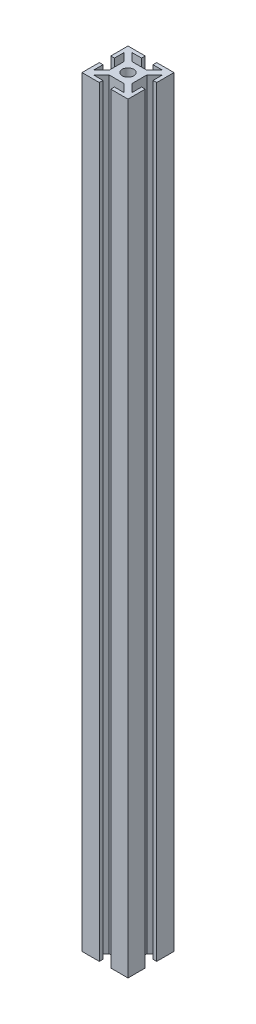
ISO-10303-21;
HEADER;
FILE_DESCRIPTION(('STEP AP214'),'2;1');
FILE_NAME('part.step','',(''),(''),'','','');
FILE_SCHEMA(('AUTOMOTIVE_DESIGN { 1 0 10303 214 1 1 1 1 }'));
ENDSEC;
DATA;
#1=APPLICATION_CONTEXT('core data for automotive mechanical design processes');
#2=APPLICATION_PROTOCOL_DEFINITION('international standard','automotive_design',2000,#1);
#3=PRODUCT_CONTEXT('',#1,'mechanical');
#4=PRODUCT('Part','Part','',(#3));
#5=PRODUCT_RELATED_PRODUCT_CATEGORY('part','',(#4));
#6=PRODUCT_DEFINITION_FORMATION('','',#4);
#7=PRODUCT_DEFINITION_CONTEXT('part definition',#1,'design');
#8=PRODUCT_DEFINITION('design','',#6,#7);
#9=PRODUCT_DEFINITION_SHAPE('','',#8);
#10=(LENGTH_UNIT() NAMED_UNIT(*) SI_UNIT(.MILLI.,.METRE.));
#11=(NAMED_UNIT(*) PLANE_ANGLE_UNIT() SI_UNIT($,.RADIAN.));
#12=(NAMED_UNIT(*) SI_UNIT($,.STERADIAN.) SOLID_ANGLE_UNIT());
#13=UNCERTAINTY_MEASURE_WITH_UNIT(LENGTH_MEASURE(1.E-05),#10,'distance_accuracy_value','');
#14=(GEOMETRIC_REPRESENTATION_CONTEXT(3) GLOBAL_UNCERTAINTY_ASSIGNED_CONTEXT((#13)) GLOBAL_UNIT_ASSIGNED_CONTEXT((#10,
#11,#12)) REPRESENTATION_CONTEXT('',''));
#15=CARTESIAN_POINT('',(0.,0.,0.));
#16=DIRECTION('',(0.,0.,1.));
#17=DIRECTION('',(1.,0.,0.));
#18=AXIS2_PLACEMENT_3D('',#15,#16,#17);
#19=CARTESIAN_POINT('',(2.5,331.,0.));
#20=DIRECTION('',(1.,0.,0.));
#21=DIRECTION('',(0.,0.,-1.));
#22=AXIS2_PLACEMENT_3D('',#19,#20,#21);
#23=PLANE('',#22);
#24=DIRECTION('',(0.,1.,0.));
#25=VECTOR('',#24,1.);
#26=CARTESIAN_POINT('',(2.5,-5.3178515935004,8.40380592228745));
#27=LINE('',#26,#25);
#28=CARTESIAN_POINT('',(2.5,0.,8.40380592228745));
#29=VERTEX_POINT('',#28);
#30=CARTESIAN_POINT('',(2.5,331.,8.40380592228745));
#31=VERTEX_POINT('',#30);
#32=EDGE_CURVE('E671',#29,#31,#27,.T.);
#33=ORIENTED_EDGE('',*,*,#32,.F.);
#34=DIRECTION('',(0.,0.,1.));
#35=VECTOR('',#34,1.);
#36=CARTESIAN_POINT('',(2.5,0.,0.));
#37=LINE('',#36,#35);
#38=CARTESIAN_POINT('',(2.5,0.,10.));
#39=VERTEX_POINT('',#38);
#40=EDGE_CURVE('E494',#29,#39,#37,.T.);
#41=ORIENTED_EDGE('',*,*,#40,.T.);
#42=DIRECTION('',(0.,-1.,0.));
#43=VECTOR('',#42,1.);
#44=CARTESIAN_POINT('',(2.5,331.,10.));
#45=LINE('',#44,#43);
#46=CARTESIAN_POINT('',(2.5,331.,10.));
#47=VERTEX_POINT('',#46);
#48=EDGE_CURVE('E12',#47,#39,#45,.T.);
#49=ORIENTED_EDGE('',*,*,#48,.F.);
#50=DIRECTION('',(0.,0.,1.));
#51=VECTOR('',#50,1.);
#52=CARTESIAN_POINT('',(2.5,331.,0.));
#53=LINE('',#52,#51);
#54=EDGE_CURVE('E588',#31,#47,#53,.T.);
#55=ORIENTED_EDGE('',*,*,#54,.F.);
#56=EDGE_LOOP('',(#33,#41,#49,#55));
#57=FACE_BOUND('',#56,.T.);
#58=ADVANCED_FACE('F143',(#57),#23,.F.);
#59=CARTESIAN_POINT('',(0.,331.,-2.5));
#60=DIRECTION('',(0.,0.,-1.));
#61=DIRECTION('',(-1.,0.,0.));
#62=AXIS2_PLACEMENT_3D('',#59,#60,#61);
#63=PLANE('',#62);
#64=DIRECTION('',(0.,1.,0.));
#65=VECTOR('',#64,1.);
#66=CARTESIAN_POINT('',(8.40380592228744,-5.3178515935004,-2.5));
#67=LINE('',#66,#65);
#68=CARTESIAN_POINT('',(8.40380592228744,0.,-2.5));
#69=VERTEX_POINT('',#68);
#70=CARTESIAN_POINT('',(8.40380592228744,331.,-2.5));
#71=VERTEX_POINT('',#70);
#72=EDGE_CURVE('E816',#69,#71,#67,.T.);
#73=ORIENTED_EDGE('',*,*,#72,.F.);
#74=DIRECTION('',(1.,0.,0.));
#75=VECTOR('',#74,1.);
#76=CARTESIAN_POINT('',(0.,0.,-2.5));
#77=LINE('',#76,#75);
#78=CARTESIAN_POINT('',(10.,0.,-2.5));
#79=VERTEX_POINT('',#78);
#80=EDGE_CURVE('E859',#69,#79,#77,.T.);
#81=ORIENTED_EDGE('',*,*,#80,.T.);
#82=DIRECTION('',(0.,-1.,0.));
#83=VECTOR('',#82,1.);
#84=CARTESIAN_POINT('',(10.,331.,-2.5));
#85=LINE('',#84,#83);
#86=CARTESIAN_POINT('',(10.,331.,-2.5));
#87=VERTEX_POINT('',#86);
#88=EDGE_CURVE('E462',#87,#79,#85,.T.);
#89=ORIENTED_EDGE('',*,*,#88,.F.);
#90=DIRECTION('',(1.,0.,0.));
#91=VECTOR('',#90,1.);
#92=CARTESIAN_POINT('',(0.,331.,-2.5));
#93=LINE('',#92,#91);
#94=EDGE_CURVE('E603',#71,#87,#93,.T.);
#95=ORIENTED_EDGE('',*,*,#94,.F.);
#96=EDGE_LOOP('',(#73,#81,#89,#95));
#97=FACE_BOUND('',#96,.T.);
#98=ADVANCED_FACE('F863',(#97),#63,.F.);
#99=CARTESIAN_POINT('',(-2.5,331.,0.));
#100=DIRECTION('',(-1.,0.,0.));
#101=DIRECTION('',(0.,0.,1.));
#102=AXIS2_PLACEMENT_3D('',#99,#100,#101);
#103=PLANE('',#102);
#104=DIRECTION('',(0.,1.,0.));
#105=VECTOR('',#104,1.);
#106=CARTESIAN_POINT('',(-2.5,-5.3178515935004,-8.40380592228745));
#107=LINE('',#106,#105);
#108=CARTESIAN_POINT('',(-2.5,0.,-8.40380592228745));
#109=VERTEX_POINT('',#108);
#110=CARTESIAN_POINT('',(-2.5,331.,-8.40380592228745));
#111=VERTEX_POINT('',#110);
#112=EDGE_CURVE('E574',#109,#111,#107,.T.);
#113=ORIENTED_EDGE('',*,*,#112,.F.);
#114=DIRECTION('',(0.,0.,-1.));
#115=VECTOR('',#114,1.);
#116=CARTESIAN_POINT('',(-2.5,0.,0.));
#117=LINE('',#116,#115);
#118=CARTESIAN_POINT('',(-2.5,0.,-10.));
#119=VERTEX_POINT('',#118);
#120=EDGE_CURVE('E410',#109,#119,#117,.T.);
#121=ORIENTED_EDGE('',*,*,#120,.T.);
#122=DIRECTION('',(0.,-1.,0.));
#123=VECTOR('',#122,1.);
#124=CARTESIAN_POINT('',(-2.5,331.,-10.));
#125=LINE('',#124,#123);
#126=CARTESIAN_POINT('',(-2.5,331.,-10.));
#127=VERTEX_POINT('',#126);
#128=EDGE_CURVE('E452',#127,#119,#125,.T.);
#129=ORIENTED_EDGE('',*,*,#128,.F.);
#130=DIRECTION('',(0.,0.,-1.));
#131=VECTOR('',#130,1.);
#132=CARTESIAN_POINT('',(-2.5,331.,0.));
#133=LINE('',#132,#131);
#134=EDGE_CURVE('E617',#111,#127,#133,.T.);
#135=ORIENTED_EDGE('',*,*,#134,.F.);
#136=EDGE_LOOP('',(#113,#121,#129,#135));
#137=FACE_BOUND('',#136,.T.);
#138=ADVANCED_FACE('F751',(#137),#103,.F.);
#139=CARTESIAN_POINT('',(0.,331.,2.5));
#140=DIRECTION('',(0.,0.,1.));
#141=DIRECTION('',(1.,0.,0.));
#142=AXIS2_PLACEMENT_3D('',#139,#140,#141);
#143=PLANE('',#142);
#144=DIRECTION('',(0.,1.,0.));
#145=VECTOR('',#144,1.);
#146=CARTESIAN_POINT('',(-8.40380592228744,-5.3178515935004,2.5));
#147=LINE('',#146,#145);
#148=CARTESIAN_POINT('',(-8.40380592228744,0.,2.5));
#149=VERTEX_POINT('',#148);
#150=CARTESIAN_POINT('',(-8.40380592228744,331.,2.5));
#151=VERTEX_POINT('',#150);
#152=EDGE_CURVE('E524',#149,#151,#147,.T.);
#153=ORIENTED_EDGE('',*,*,#152,.F.);
#154=DIRECTION('',(-1.,0.,0.));
#155=VECTOR('',#154,1.);
#156=CARTESIAN_POINT('',(0.,0.,2.5));
#157=LINE('',#156,#155);
#158=CARTESIAN_POINT('',(-10.,0.,2.5));
#159=VERTEX_POINT('',#158);
#160=EDGE_CURVE('E430',#149,#159,#157,.T.);
#161=ORIENTED_EDGE('',*,*,#160,.T.);
#162=DIRECTION('',(0.,-1.,0.));
#163=VECTOR('',#162,1.);
#164=CARTESIAN_POINT('',(-10.,331.,2.5));
#165=LINE('',#164,#163);
#166=CARTESIAN_POINT('',(-10.,331.,2.5));
#167=VERTEX_POINT('',#166);
#168=EDGE_CURVE('E441',#167,#159,#165,.T.);
#169=ORIENTED_EDGE('',*,*,#168,.F.);
#170=DIRECTION('',(-1.,0.,0.));
#171=VECTOR('',#170,1.);
#172=CARTESIAN_POINT('',(0.,331.,2.5));
#173=LINE('',#172,#171);
#174=EDGE_CURVE('E523',#151,#167,#173,.T.);
#175=ORIENTED_EDGE('',*,*,#174,.F.);
#176=EDGE_LOOP('',(#153,#161,#169,#175));
#177=FACE_BOUND('',#176,.T.);
#178=ADVANCED_FACE('F522',(#177),#143,.F.);
#179=CARTESIAN_POINT('',(0.,331.,0.));
#180=DIRECTION('',(0.,1.,0.));
#181=DIRECTION('',(0.,0.,1.));
#182=AXIS2_PLACEMENT_3D('',#179,#180,#181);
#183=PLANE('',#182);
#184=DIRECTION('',(-1.,0.,0.));
#185=VECTOR('',#184,1.);
#186=CARTESIAN_POINT('',(0.,331.,5.));
#187=LINE('',#186,#185);
#188=CARTESIAN_POINT('',(3.18198051533946,331.,5.));
#189=VERTEX_POINT('',#188);
#190=CARTESIAN_POINT('',(-3.18198051533946,331.,5.));
#191=VERTEX_POINT('',#190);
#192=EDGE_CURVE('E585',#189,#191,#187,.T.);
#193=ORIENTED_EDGE('',*,*,#192,.F.);
#194=DIRECTION('',(0.707106781186547,0.,0.707106781186548));
#195=VECTOR('',#194,1.);
#196=CARTESIAN_POINT('',(3.18198051533946,331.,5.));
#197=LINE('',#196,#195);
#198=CARTESIAN_POINT('',(6.58578643762691,331.,8.40380592228745));
#199=VERTEX_POINT('',#198);
#200=EDGE_CURVE('E674',#189,#199,#197,.T.);
#201=ORIENTED_EDGE('',*,*,#200,.T.);
#202=DIRECTION('',(-1.,0.,0.));
#203=VECTOR('',#202,1.);
#204=CARTESIAN_POINT('',(6.58578643762691,331.,8.40380592228745));
#205=LINE('',#204,#203);
#206=EDGE_CURVE('E654',#199,#31,#205,.T.);
#207=ORIENTED_EDGE('',*,*,#206,.T.);
#208=ORIENTED_EDGE('',*,*,#54,.T.);
#209=DIRECTION('',(-1.,0.,0.));
#210=VECTOR('',#209,1.);
#211=CARTESIAN_POINT('',(0.,331.,10.));
#212=LINE('',#211,#210);
#213=CARTESIAN_POINT('',(10.,331.,9.99999999999999));
#214=VERTEX_POINT('',#213);
#215=EDGE_CURVE('E591',#214,#47,#212,.T.);
#216=ORIENTED_EDGE('',*,*,#215,.F.);
#217=DIRECTION('',(0.,0.,-1.));
#218=VECTOR('',#217,1.);
#219=CARTESIAN_POINT('',(10.,331.,0.));
#220=LINE('',#219,#218);
#221=CARTESIAN_POINT('',(10.,331.,2.5));
#222=VERTEX_POINT('',#221);
#223=EDGE_CURVE('E478',#214,#222,#220,.T.);
#224=ORIENTED_EDGE('',*,*,#223,.T.);
#225=DIRECTION('',(1.,0.,0.));
#226=VECTOR('',#225,1.);
#227=CARTESIAN_POINT('',(0.,331.,2.5));
#228=LINE('',#227,#226);
#229=CARTESIAN_POINT('',(8.40380592228744,331.,2.5));
#230=VERTEX_POINT('',#229);
#231=EDGE_CURVE('E596',#230,#222,#228,.T.);
#232=ORIENTED_EDGE('',*,*,#231,.F.);
#233=DIRECTION('',(0.,0.,-1.));
#234=VECTOR('',#233,1.);
#235=CARTESIAN_POINT('',(8.40380592228744,331.,6.58578643762691));
#236=LINE('',#235,#234);
#237=CARTESIAN_POINT('',(8.40380592228744,331.,6.58578643762691));
#238=VERTEX_POINT('',#237);
#239=EDGE_CURVE('E792',#238,#230,#236,.T.);
#240=ORIENTED_EDGE('',*,*,#239,.F.);
#241=DIRECTION('',(0.707106781186548,0.,0.707106781186548));
#242=VECTOR('',#241,1.);
#243=CARTESIAN_POINT('',(5.,331.,3.18198051533947));
#244=LINE('',#243,#242);
#245=CARTESIAN_POINT('',(5.,331.,3.18198051533947));
#246=VERTEX_POINT('',#245);
#247=EDGE_CURVE('E689',#246,#238,#244,.T.);
#248=ORIENTED_EDGE('',*,*,#247,.F.);
#249=DIRECTION('',(0.,0.,-1.));
#250=VECTOR('',#249,1.);
#251=CARTESIAN_POINT('',(5.,331.,0.));
#252=LINE('',#251,#250);
#253=CARTESIAN_POINT('',(5.,331.,-3.18198051533947));
#254=VERTEX_POINT('',#253);
#255=EDGE_CURVE('E600',#246,#254,#252,.T.);
#256=ORIENTED_EDGE('',*,*,#255,.T.);
#257=DIRECTION('',(0.707106781186548,0.,-0.707106781186548));
#258=VECTOR('',#257,1.);
#259=CARTESIAN_POINT('',(5.,331.,-3.18198051533947));
#260=LINE('',#259,#258);
#261=CARTESIAN_POINT('',(8.40380592228744,331.,-6.58578643762691));
#262=VERTEX_POINT('',#261);
#263=EDGE_CURVE('E787',#254,#262,#260,.T.);
#264=ORIENTED_EDGE('',*,*,#263,.T.);
#265=DIRECTION('',(0.,0.,1.));
#266=VECTOR('',#265,1.);
#267=CARTESIAN_POINT('',(8.40380592228744,331.,-6.58578643762691));
#268=LINE('',#267,#266);
#269=EDGE_CURVE('E819',#262,#71,#268,.T.);
#270=ORIENTED_EDGE('',*,*,#269,.T.);
#271=ORIENTED_EDGE('',*,*,#94,.T.);
#272=CARTESIAN_POINT('',(10.,331.,-10.));
#273=VERTEX_POINT('',#272);
#274=EDGE_CURVE('E597',#87,#273,#220,.T.);
#275=ORIENTED_EDGE('',*,*,#274,.T.);
#276=DIRECTION('',(-1.,0.,0.));
#277=VECTOR('',#276,1.);
#278=CARTESIAN_POINT('',(0.,331.,-10.));
#279=LINE('',#278,#277);
#280=CARTESIAN_POINT('',(2.5,331.,-10.));
#281=VERTEX_POINT('',#280);
#282=EDGE_CURVE('E606',#273,#281,#279,.T.);
#283=ORIENTED_EDGE('',*,*,#282,.T.);
#284=DIRECTION('',(0.,0.,-1.));
#285=VECTOR('',#284,1.);
#286=CARTESIAN_POINT('',(2.5,331.,0.));
#287=LINE('',#286,#285);
#288=CARTESIAN_POINT('',(2.5,331.,-8.40380592228745));
#289=VERTEX_POINT('',#288);
#290=EDGE_CURVE('E610',#289,#281,#287,.T.);
#291=ORIENTED_EDGE('',*,*,#290,.F.);
#292=DIRECTION('',(-1.,0.,0.));
#293=VECTOR('',#292,1.);
#294=CARTESIAN_POINT('',(6.58578643762691,331.,-8.40380592228745));
#295=LINE('',#294,#293);
#296=CARTESIAN_POINT('',(6.58578643762691,331.,-8.40380592228745));
#297=VERTEX_POINT('',#296);
#298=EDGE_CURVE('E384',#297,#289,#295,.T.);
#299=ORIENTED_EDGE('',*,*,#298,.F.);
#300=DIRECTION('',(0.707106781186547,0.,-0.707106781186548));
#301=VECTOR('',#300,1.);
#302=CARTESIAN_POINT('',(3.18198051533946,331.,-5.));
#303=LINE('',#302,#301);
#304=CARTESIAN_POINT('',(3.18198051533946,331.,-5.));
#305=VERTEX_POINT('',#304);
#306=EDGE_CURVE('E776',#305,#297,#303,.T.);
#307=ORIENTED_EDGE('',*,*,#306,.F.);
#308=DIRECTION('',(-1.,0.,0.));
#309=VECTOR('',#308,1.);
#310=CARTESIAN_POINT('',(0.,331.,-5.));
#311=LINE('',#310,#309);
#312=CARTESIAN_POINT('',(-3.18198051533946,331.,-5.));
#313=VERTEX_POINT('',#312);
#314=EDGE_CURVE('E614',#305,#313,#311,.T.);
#315=ORIENTED_EDGE('',*,*,#314,.T.);
#316=DIRECTION('',(-0.707106781186547,0.,-0.707106781186548));
#317=VECTOR('',#316,1.);
#318=CARTESIAN_POINT('',(-3.18198051533946,331.,-5.));
#319=LINE('',#318,#317);
#320=CARTESIAN_POINT('',(-6.58578643762691,331.,-8.40380592228745));
#321=VERTEX_POINT('',#320);
#322=EDGE_CURVE('E569',#313,#321,#319,.T.);
#323=ORIENTED_EDGE('',*,*,#322,.T.);
#324=DIRECTION('',(1.,0.,0.));
#325=VECTOR('',#324,1.);
#326=CARTESIAN_POINT('',(-6.58578643762691,331.,-8.40380592228745));
#327=LINE('',#326,#325);
#328=EDGE_CURVE('E565',#321,#111,#327,.T.);
#329=ORIENTED_EDGE('',*,*,#328,.T.);
#330=ORIENTED_EDGE('',*,*,#134,.T.);
#331=CARTESIAN_POINT('',(-10.,331.,-10.));
#332=VERTEX_POINT('',#331);
#333=EDGE_CURVE('E611',#127,#332,#279,.T.);
#334=ORIENTED_EDGE('',*,*,#333,.T.);
#335=DIRECTION('',(0.,0.,-1.));
#336=VECTOR('',#335,1.);
#337=CARTESIAN_POINT('',(-10.,331.,0.));
#338=LINE('',#337,#336);
#339=CARTESIAN_POINT('',(-10.,331.,-2.5));
#340=VERTEX_POINT('',#339);
#341=EDGE_CURVE('E620',#340,#332,#338,.T.);
#342=ORIENTED_EDGE('',*,*,#341,.F.);
#343=DIRECTION('',(-1.,0.,0.));
#344=VECTOR('',#343,1.);
#345=CARTESIAN_POINT('',(0.,331.,-2.5));
#346=LINE('',#345,#344);
#347=CARTESIAN_POINT('',(-8.40380592228744,331.,-2.5));
#348=VERTEX_POINT('',#347);
#349=EDGE_CURVE('E624',#348,#340,#346,.T.);
#350=ORIENTED_EDGE('',*,*,#349,.F.);
#351=DIRECTION('',(0.,0.,1.));
#352=VECTOR('',#351,1.);
#353=CARTESIAN_POINT('',(-8.40380592228744,331.,-6.58578643762691));
#354=LINE('',#353,#352);
#355=CARTESIAN_POINT('',(-8.40380592228744,331.,-6.58578643762691));
#356=VERTEX_POINT('',#355);
#357=EDGE_CURVE('E570',#356,#348,#354,.T.);
#358=ORIENTED_EDGE('',*,*,#357,.F.);
#359=DIRECTION('',(-0.707106781186548,0.,-0.707106781186548));
#360=VECTOR('',#359,1.);
#361=CARTESIAN_POINT('',(-5.,331.,-3.18198051533947));
#362=LINE('',#361,#360);
#363=CARTESIAN_POINT('',(-5.,331.,-3.18198051533947));
#364=VERTEX_POINT('',#363);
#365=EDGE_CURVE('E696',#364,#356,#362,.T.);
#366=ORIENTED_EDGE('',*,*,#365,.F.);
#367=DIRECTION('',(0.,0.,-1.));
#368=VECTOR('',#367,1.);
#369=CARTESIAN_POINT('',(-5.,331.,0.));
#370=LINE('',#369,#368);
#371=CARTESIAN_POINT('',(-5.,331.,3.18198051533947));
#372=VERTEX_POINT('',#371);
#373=EDGE_CURVE('E627',#372,#364,#370,.T.);
#374=ORIENTED_EDGE('',*,*,#373,.F.);
#375=DIRECTION('',(-0.707106781186548,0.,0.707106781186548));
#376=VECTOR('',#375,1.);
#377=CARTESIAN_POINT('',(-5.,331.,3.18198051533947));
#378=LINE('',#377,#376);
#379=CARTESIAN_POINT('',(-8.40380592228744,331.,6.58578643762691));
#380=VERTEX_POINT('',#379);
#381=EDGE_CURVE('E543',#372,#380,#378,.T.);
#382=ORIENTED_EDGE('',*,*,#381,.T.);
#383=DIRECTION('',(0.,0.,-1.));
#384=VECTOR('',#383,1.);
#385=CARTESIAN_POINT('',(-8.40380592228744,331.,6.58578643762691));
#386=LINE('',#385,#384);
#387=EDGE_CURVE('E535',#380,#151,#386,.T.);
#388=ORIENTED_EDGE('',*,*,#387,.T.);
#389=ORIENTED_EDGE('',*,*,#174,.T.);
#390=CARTESIAN_POINT('',(-10.,331.,10.));
#391=VERTEX_POINT('',#390);
#392=EDGE_CURVE('E518',#391,#167,#338,.T.);
#393=ORIENTED_EDGE('',*,*,#392,.F.);
#394=CARTESIAN_POINT('',(-2.5,331.,10.));
#395=VERTEX_POINT('',#394);
#396=EDGE_CURVE('E438',#395,#391,#212,.T.);
#397=ORIENTED_EDGE('',*,*,#396,.F.);
#398=DIRECTION('',(0.,0.,1.));
#399=VECTOR('',#398,1.);
#400=CARTESIAN_POINT('',(-2.5,331.,0.));
#401=LINE('',#400,#399);
#402=CARTESIAN_POINT('',(-2.5,331.,8.40380592228745));
#403=VERTEX_POINT('',#402);
#404=EDGE_CURVE('E508',#403,#395,#401,.T.);
#405=ORIENTED_EDGE('',*,*,#404,.F.);
#406=DIRECTION('',(1.,0.,0.));
#407=VECTOR('',#406,1.);
#408=CARTESIAN_POINT('',(-6.58578643762691,331.,8.40380592228745));
#409=LINE('',#408,#407);
#410=CARTESIAN_POINT('',(-6.58578643762691,331.,8.40380592228745));
#411=VERTEX_POINT('',#410);
#412=EDGE_CURVE('E552',#411,#403,#409,.T.);
#413=ORIENTED_EDGE('',*,*,#412,.F.);
#414=DIRECTION('',(-0.707106781186547,0.,0.707106781186548));
#415=VECTOR('',#414,1.);
#416=CARTESIAN_POINT('',(-3.18198051533946,331.,5.));
#417=LINE('',#416,#415);
#418=EDGE_CURVE('E658',#191,#411,#417,.T.);
#419=ORIENTED_EDGE('',*,*,#418,.F.);
#420=EDGE_LOOP('',(#193,#201,#207,#208,#216,#224,#232,#240,#248,#256,#264,#270,#271,#275,#283,
#291,#299,#307,#315,#323,#329,#330,#334,#342,#350,#358,#366,#374,#382,#388,#389,#393,#397,#405,
#413,#419));
#421=FACE_BOUND('',#420,.T.);
#422=CARTESIAN_POINT('',(0.,331.,0.));
#423=DIRECTION('',(0.,1.,0.));
#424=DIRECTION('',(0.,0.,1.));
#425=AXIS2_PLACEMENT_3D('',#422,#423,#424);
#426=CIRCLE('',#425,2.5);
#427=CARTESIAN_POINT('',(0.,331.,2.49999999999999));
#428=VERTEX_POINT('',#427);
#429=EDGE_CURVE('E502',#428,#428,#426,.T.);
#430=ORIENTED_EDGE('',*,*,#429,.F.);
#431=EDGE_LOOP('',(#430));
#432=FACE_BOUND('',#431,.T.);
#433=ADVANCED_FACE('F726',(#421,#432),#183,.T.);
#434=CARTESIAN_POINT('',(0.,0.,0.));
#435=DIRECTION('',(0.,1.,0.));
#436=DIRECTION('',(0.,0.,1.));
#437=AXIS2_PLACEMENT_3D('',#434,#435,#436);
#438=PLANE('',#437);
#439=CARTESIAN_POINT('',(0.,0.,0.));
#440=DIRECTION('',(0.,1.,0.));
#441=DIRECTION('',(0.,0.,1.));
#442=AXIS2_PLACEMENT_3D('',#439,#440,#441);
#443=CIRCLE('',#442,2.5);
#444=CARTESIAN_POINT('',(0.,0.,2.49999999999999));
#445=VERTEX_POINT('',#444);
#446=EDGE_CURVE('E564',#445,#445,#443,.T.);
#447=ORIENTED_EDGE('',*,*,#446,.T.);
#448=EDGE_LOOP('',(#447));
#449=FACE_BOUND('',#448,.T.);
#450=DIRECTION('',(-0.707106781186547,0.,-0.707106781186548));
#451=VECTOR('',#450,1.);
#452=CARTESIAN_POINT('',(3.18198051533946,0.,5.));
#453=LINE('',#452,#451);
#454=CARTESIAN_POINT('',(6.58578643762691,0.,8.40380592228745));
#455=VERTEX_POINT('',#454);
#456=CARTESIAN_POINT('',(3.18198051533946,0.,5.));
#457=VERTEX_POINT('',#456);
#458=EDGE_CURVE('E643',#455,#457,#453,.T.);
#459=ORIENTED_EDGE('',*,*,#458,.T.);
#460=DIRECTION('',(-1.,0.,0.));
#461=VECTOR('',#460,1.);
#462=CARTESIAN_POINT('',(0.,0.,5.));
#463=LINE('',#462,#461);
#464=CARTESIAN_POINT('',(-3.18198051533946,0.,5.));
#465=VERTEX_POINT('',#464);
#466=EDGE_CURVE('E498',#457,#465,#463,.T.);
#467=ORIENTED_EDGE('',*,*,#466,.T.);
#468=DIRECTION('',(0.707106781186547,0.,-0.707106781186548));
#469=VECTOR('',#468,1.);
#470=CARTESIAN_POINT('',(-3.18198051533946,0.,5.));
#471=LINE('',#470,#469);
#472=CARTESIAN_POINT('',(-6.58578643762691,0.,8.40380592228745));
#473=VERTEX_POINT('',#472);
#474=EDGE_CURVE('E641',#473,#465,#471,.T.);
#475=ORIENTED_EDGE('',*,*,#474,.F.);
#476=DIRECTION('',(-1.,0.,0.));
#477=VECTOR('',#476,1.);
#478=CARTESIAN_POINT('',(-6.58578643762691,0.,8.40380592228745));
#479=LINE('',#478,#477);
#480=CARTESIAN_POINT('',(-2.5,0.,8.40380592228745));
#481=VERTEX_POINT('',#480);
#482=EDGE_CURVE('E653',#481,#473,#479,.T.);
#483=ORIENTED_EDGE('',*,*,#482,.F.);
#484=DIRECTION('',(0.,0.,1.));
#485=VECTOR('',#484,1.);
#486=CARTESIAN_POINT('',(-2.5,0.,0.));
#487=LINE('',#486,#485);
#488=CARTESIAN_POINT('',(-2.5,0.,10.));
#489=VERTEX_POINT('',#488);
#490=EDGE_CURVE('E635',#481,#489,#487,.T.);
#491=ORIENTED_EDGE('',*,*,#490,.T.);
#492=DIRECTION('',(-1.,0.,0.));
#493=VECTOR('',#492,1.);
#494=CARTESIAN_POINT('',(0.,0.,10.));
#495=LINE('',#494,#493);
#496=CARTESIAN_POINT('',(-10.,0.,10.));
#497=VERTEX_POINT('',#496);
#498=EDGE_CURVE('E496',#489,#497,#495,.T.);
#499=ORIENTED_EDGE('',*,*,#498,.T.);
#500=DIRECTION('',(0.,0.,-1.));
#501=VECTOR('',#500,1.);
#502=CARTESIAN_POINT('',(-10.,0.,0.));
#503=LINE('',#502,#501);
#504=EDGE_CURVE('E424',#497,#159,#503,.T.);
#505=ORIENTED_EDGE('',*,*,#504,.T.);
#506=ORIENTED_EDGE('',*,*,#160,.F.);
#507=DIRECTION('',(0.,0.,1.));
#508=VECTOR('',#507,1.);
#509=CARTESIAN_POINT('',(-8.40380592228744,0.,6.58578643762691));
#510=LINE('',#509,#508);
#511=CARTESIAN_POINT('',(-8.40380592228744,0.,6.58578643762691));
#512=VERTEX_POINT('',#511);
#513=EDGE_CURVE('E537',#149,#512,#510,.T.);
#514=ORIENTED_EDGE('',*,*,#513,.T.);
#515=DIRECTION('',(0.707106781186548,0.,-0.707106781186548));
#516=VECTOR('',#515,1.);
#517=CARTESIAN_POINT('',(-5.,0.,3.18198051533947));
#518=LINE('',#517,#516);
#519=CARTESIAN_POINT('',(-5.,0.,3.18198051533947));
#520=VERTEX_POINT('',#519);
#521=EDGE_CURVE('E548',#512,#520,#518,.T.);
#522=ORIENTED_EDGE('',*,*,#521,.T.);
#523=DIRECTION('',(0.,0.,-1.));
#524=VECTOR('',#523,1.);
#525=CARTESIAN_POINT('',(-5.,0.,0.));
#526=LINE('',#525,#524);
#527=CARTESIAN_POINT('',(-5.,0.,-3.18198051533947));
#528=VERTEX_POINT('',#527);
#529=EDGE_CURVE('E427',#520,#528,#526,.T.);
#530=ORIENTED_EDGE('',*,*,#529,.T.);
#531=DIRECTION('',(0.707106781186548,0.,0.707106781186548));
#532=VECTOR('',#531,1.);
#533=CARTESIAN_POINT('',(-5.,0.,-3.18198051533947));
#534=LINE('',#533,#532);
#535=CARTESIAN_POINT('',(-8.40380592228744,0.,-6.58578643762691));
#536=VERTEX_POINT('',#535);
#537=EDGE_CURVE('E704',#536,#528,#534,.T.);
#538=ORIENTED_EDGE('',*,*,#537,.F.);
#539=DIRECTION('',(0.,0.,-1.));
#540=VECTOR('',#539,1.);
#541=CARTESIAN_POINT('',(-8.40380592228744,0.,-6.58578643762691));
#542=LINE('',#541,#540);
#543=CARTESIAN_POINT('',(-8.40380592228744,0.,-2.5));
#544=VERTEX_POINT('',#543);
#545=EDGE_CURVE('E547',#544,#536,#542,.T.);
#546=ORIENTED_EDGE('',*,*,#545,.F.);
#547=DIRECTION('',(-1.,0.,0.));
#548=VECTOR('',#547,1.);
#549=CARTESIAN_POINT('',(0.,0.,-2.5));
#550=LINE('',#549,#548);
#551=CARTESIAN_POINT('',(-10.,0.,-2.5));
#552=VERTEX_POINT('',#551);
#553=EDGE_CURVE('E423',#544,#552,#550,.T.);
#554=ORIENTED_EDGE('',*,*,#553,.T.);
#555=CARTESIAN_POINT('',(-10.,0.,-10.));
#556=VERTEX_POINT('',#555);
#557=EDGE_CURVE('E419',#552,#556,#503,.T.);
#558=ORIENTED_EDGE('',*,*,#557,.T.);
#559=DIRECTION('',(-1.,0.,0.));
#560=VECTOR('',#559,1.);
#561=CARTESIAN_POINT('',(0.,0.,-10.));
#562=LINE('',#561,#560);
#563=EDGE_CURVE('E414',#119,#556,#562,.T.);
#564=ORIENTED_EDGE('',*,*,#563,.F.);
#565=ORIENTED_EDGE('',*,*,#120,.F.);
#566=DIRECTION('',(-1.,0.,0.));
#567=VECTOR('',#566,1.);
#568=CARTESIAN_POINT('',(-6.58578643762691,0.,-8.40380592228745));
#569=LINE('',#568,#567);
#570=CARTESIAN_POINT('',(-6.58578643762691,0.,-8.40380592228745));
#571=VERTEX_POINT('',#570);
#572=EDGE_CURVE('E555',#109,#571,#569,.T.);
#573=ORIENTED_EDGE('',*,*,#572,.T.);
#574=DIRECTION('',(0.707106781186547,0.,0.707106781186548));
#575=VECTOR('',#574,1.);
#576=CARTESIAN_POINT('',(-3.18198051533946,0.,-5.));
#577=LINE('',#576,#575);
#578=CARTESIAN_POINT('',(-3.18198051533946,0.,-5.));
#579=VERTEX_POINT('',#578);
#580=EDGE_CURVE('E559',#571,#579,#577,.T.);
#581=ORIENTED_EDGE('',*,*,#580,.T.);
#582=DIRECTION('',(-1.,0.,0.));
#583=VECTOR('',#582,1.);
#584=CARTESIAN_POINT('',(0.,0.,-5.));
#585=LINE('',#584,#583);
#586=CARTESIAN_POINT('',(3.18198051533946,0.,-5.));
#587=VERTEX_POINT('',#586);
#588=EDGE_CURVE('E405',#587,#579,#585,.T.);
#589=ORIENTED_EDGE('',*,*,#588,.F.);
#590=DIRECTION('',(-0.707106781186547,0.,0.707106781186548));
#591=VECTOR('',#590,1.);
#592=CARTESIAN_POINT('',(3.18198051533946,0.,-5.));
#593=LINE('',#592,#591);
#594=CARTESIAN_POINT('',(6.58578643762691,0.,-8.40380592228745));
#595=VERTEX_POINT('',#594);
#596=EDGE_CURVE('E397',#595,#587,#593,.T.);
#597=ORIENTED_EDGE('',*,*,#596,.F.);
#598=DIRECTION('',(1.,0.,0.));
#599=VECTOR('',#598,1.);
#600=CARTESIAN_POINT('',(6.58578643762691,0.,-8.40380592228745));
#601=LINE('',#600,#599);
#602=CARTESIAN_POINT('',(2.5,0.,-8.40380592228745));
#603=VERTEX_POINT('',#602);
#604=EDGE_CURVE('E381',#603,#595,#601,.T.);
#605=ORIENTED_EDGE('',*,*,#604,.F.);
#606=DIRECTION('',(0.,0.,-1.));
#607=VECTOR('',#606,1.);
#608=CARTESIAN_POINT('',(2.5,0.,0.));
#609=LINE('',#608,#607);
#610=CARTESIAN_POINT('',(2.5,0.,-10.));
#611=VERTEX_POINT('',#610);
#612=EDGE_CURVE('E394',#603,#611,#609,.T.);
#613=ORIENTED_EDGE('',*,*,#612,.T.);
#614=CARTESIAN_POINT('',(10.,0.,-10.));
#615=VERTEX_POINT('',#614);
#616=EDGE_CURVE('E406',#615,#611,#562,.T.);
#617=ORIENTED_EDGE('',*,*,#616,.F.);
#618=DIRECTION('',(0.,0.,-1.));
#619=VECTOR('',#618,1.);
#620=CARTESIAN_POINT('',(10.,0.,0.));
#621=LINE('',#620,#619);
#622=EDGE_CURVE('E412',#79,#615,#621,.T.);
#623=ORIENTED_EDGE('',*,*,#622,.F.);
#624=ORIENTED_EDGE('',*,*,#80,.F.);
#625=DIRECTION('',(0.,0.,-1.));
#626=VECTOR('',#625,1.);
#627=CARTESIAN_POINT('',(8.40380592228744,0.,-6.58578643762691));
#628=LINE('',#627,#626);
#629=CARTESIAN_POINT('',(8.40380592228744,0.,-6.58578643762691));
#630=VERTEX_POINT('',#629);
#631=EDGE_CURVE('E813',#69,#630,#628,.T.);
#632=ORIENTED_EDGE('',*,*,#631,.T.);
#633=DIRECTION('',(-0.707106781186548,0.,0.707106781186548));
#634=VECTOR('',#633,1.);
#635=CARTESIAN_POINT('',(5.,0.,-3.18198051533947));
#636=LINE('',#635,#634);
#637=CARTESIAN_POINT('',(5.,0.,-3.18198051533947));
#638=VERTEX_POINT('',#637);
#639=EDGE_CURVE('E780',#630,#638,#636,.T.);
#640=ORIENTED_EDGE('',*,*,#639,.T.);
#641=DIRECTION('',(0.,0.,-1.));
#642=VECTOR('',#641,1.);
#643=CARTESIAN_POINT('',(5.,0.,0.));
#644=LINE('',#643,#642);
#645=CARTESIAN_POINT('',(5.,0.,3.18198051533947));
#646=VERTEX_POINT('',#645);
#647=EDGE_CURVE('E865',#646,#638,#644,.T.);
#648=ORIENTED_EDGE('',*,*,#647,.F.);
#649=DIRECTION('',(-0.707106781186548,0.,-0.707106781186548));
#650=VECTOR('',#649,1.);
#651=CARTESIAN_POINT('',(5.,0.,3.18198051533947));
#652=LINE('',#651,#650);
#653=CARTESIAN_POINT('',(8.40380592228744,0.,6.58578643762691));
#654=VERTEX_POINT('',#653);
#655=EDGE_CURVE('E782',#654,#646,#652,.T.);
#656=ORIENTED_EDGE('',*,*,#655,.F.);
#657=DIRECTION('',(0.,0.,1.));
#658=VECTOR('',#657,1.);
#659=CARTESIAN_POINT('',(8.40380592228744,0.,6.58578643762691));
#660=LINE('',#659,#658);
#661=CARTESIAN_POINT('',(8.40380592228744,0.,2.5));
#662=VERTEX_POINT('',#661);
#663=EDGE_CURVE('E786',#662,#654,#660,.T.);
#664=ORIENTED_EDGE('',*,*,#663,.F.);
#665=DIRECTION('',(1.,0.,0.));
#666=VECTOR('',#665,1.);
#667=CARTESIAN_POINT('',(0.,0.,2.5));
#668=LINE('',#667,#666);
#669=CARTESIAN_POINT('',(10.,0.,2.5));
#670=VERTEX_POINT('',#669);
#671=EDGE_CURVE('E488',#662,#670,#668,.T.);
#672=ORIENTED_EDGE('',*,*,#671,.T.);
#673=CARTESIAN_POINT('',(10.,0.,9.99999999999999));
#674=VERTEX_POINT('',#673);
#675=EDGE_CURVE('E476',#674,#670,#621,.T.);
#676=ORIENTED_EDGE('',*,*,#675,.F.);
#677=EDGE_CURVE('E485',#674,#39,#495,.T.);
#678=ORIENTED_EDGE('',*,*,#677,.T.);
#679=ORIENTED_EDGE('',*,*,#40,.F.);
#680=DIRECTION('',(1.,0.,0.));
#681=VECTOR('',#680,1.);
#682=CARTESIAN_POINT('',(6.58578643762691,0.,8.40380592228745));
#683=LINE('',#682,#681);
#684=EDGE_CURVE('E680',#29,#455,#683,.T.);
#685=ORIENTED_EDGE('',*,*,#684,.T.);
#686=EDGE_LOOP('',(#459,#467,#475,#483,#491,#499,#505,#506,#514,#522,#530,#538,#546,#554,#558,
#564,#565,#573,#581,#589,#597,#605,#613,#617,#623,#624,#632,#640,#648,#656,#664,#672,#676,#678,
#679,#685));
#687=FACE_BOUND('',#686,.T.);
#688=ADVANCED_FACE('F393',(#449,#687),#438,.F.);
#689=CARTESIAN_POINT('',(-2.5,331.,0.));
#690=DIRECTION('',(1.,0.,0.));
#691=DIRECTION('',(0.,0.,-1.));
#692=AXIS2_PLACEMENT_3D('',#689,#690,#691);
#693=PLANE('',#692);
#694=DIRECTION('',(0.,1.,0.));
#695=VECTOR('',#694,1.);
#696=CARTESIAN_POINT('',(-2.5,-5.3178515935004,8.40380592228745));
#697=LINE('',#696,#695);
#698=EDGE_CURVE('E663',#481,#403,#697,.T.);
#699=ORIENTED_EDGE('',*,*,#698,.T.);
#700=ORIENTED_EDGE('',*,*,#404,.T.);
#701=DIRECTION('',(0.,-1.,0.));
#702=VECTOR('',#701,1.);
#703=CARTESIAN_POINT('',(-2.5,331.,10.));
#704=LINE('',#703,#702);
#705=EDGE_CURVE('E433',#395,#489,#704,.T.);
#706=ORIENTED_EDGE('',*,*,#705,.T.);
#707=ORIENTED_EDGE('',*,*,#490,.F.);
#708=EDGE_LOOP('',(#699,#700,#706,#707));
#709=FACE_BOUND('',#708,.T.);
#710=ADVANCED_FACE('F836',(#709),#693,.T.);
#711=CARTESIAN_POINT('',(0.,331.,5.));
#712=DIRECTION('',(0.,0.,1.));
#713=DIRECTION('',(1.,0.,0.));
#714=AXIS2_PLACEMENT_3D('',#711,#712,#713);
#715=PLANE('',#714);
#716=ORIENTED_EDGE('',*,*,#466,.F.);
#717=DIRECTION('',(0.,1.,0.));
#718=VECTOR('',#717,1.);
#719=CARTESIAN_POINT('',(3.18198051533946,-5.3178515935004,5.));
#720=LINE('',#719,#718);
#721=EDGE_CURVE('E677',#457,#189,#720,.T.);
#722=ORIENTED_EDGE('',*,*,#721,.T.);
#723=ORIENTED_EDGE('',*,*,#192,.T.);
#724=DIRECTION('',(0.,1.,0.));
#725=VECTOR('',#724,1.);
#726=CARTESIAN_POINT('',(-3.18198051533946,-5.3178515935004,5.));
#727=LINE('',#726,#725);
#728=EDGE_CURVE('E650',#465,#191,#727,.T.);
#729=ORIENTED_EDGE('',*,*,#728,.F.);
#730=EDGE_LOOP('',(#716,#722,#723,#729));
#731=FACE_BOUND('',#730,.T.);
#732=ADVANCED_FACE('F656',(#731),#715,.T.);
#733=CARTESIAN_POINT('',(0.,331.,10.));
#734=DIRECTION('',(0.,0.,1.));
#735=DIRECTION('',(1.,0.,0.));
#736=AXIS2_PLACEMENT_3D('',#733,#734,#735);
#737=PLANE('',#736);
#738=ORIENTED_EDGE('',*,*,#677,.F.);
#739=DIRECTION('',(0.,-1.,0.));
#740=VECTOR('',#739,1.);
#741=CARTESIAN_POINT('',(10.,331.,9.99999999999999));
#742=LINE('',#741,#740);
#743=EDGE_CURVE('E152',#214,#674,#742,.T.);
#744=ORIENTED_EDGE('',*,*,#743,.F.);
#745=ORIENTED_EDGE('',*,*,#215,.T.);
#746=ORIENTED_EDGE('',*,*,#48,.T.);
#747=EDGE_LOOP('',(#738,#744,#745,#746));
#748=FACE_BOUND('',#747,.T.);
#749=ADVANCED_FACE('F491',(#748),#737,.T.);
#750=CARTESIAN_POINT('',(10.,331.,0.));
#751=DIRECTION('',(-1.,0.,0.));
#752=DIRECTION('',(0.,0.,1.));
#753=AXIS2_PLACEMENT_3D('',#750,#751,#752);
#754=PLANE('',#753);
#755=ORIENTED_EDGE('',*,*,#675,.T.);
#756=DIRECTION('',(0.,-1.,0.));
#757=VECTOR('',#756,1.);
#758=CARTESIAN_POINT('',(10.,331.,2.5));
#759=LINE('',#758,#757);
#760=EDGE_CURVE('E466',#222,#670,#759,.T.);
#761=ORIENTED_EDGE('',*,*,#760,.F.);
#762=ORIENTED_EDGE('',*,*,#223,.F.);
#763=ORIENTED_EDGE('',*,*,#743,.T.);
#764=EDGE_LOOP('',(#755,#761,#762,#763));
#765=FACE_BOUND('',#764,.T.);
#766=ADVANCED_FACE('F474',(#765),#754,.F.);
#767=CARTESIAN_POINT('',(0.,331.,2.5));
#768=DIRECTION('',(0.,0.,-1.));
#769=DIRECTION('',(-1.,0.,0.));
#770=AXIS2_PLACEMENT_3D('',#767,#768,#769);
#771=PLANE('',#770);
#772=DIRECTION('',(0.,1.,0.));
#773=VECTOR('',#772,1.);
#774=CARTESIAN_POINT('',(8.40380592228744,-5.3178515935004,2.5));
#775=LINE('',#774,#773);
#776=EDGE_CURVE('E796',#662,#230,#775,.T.);
#777=ORIENTED_EDGE('',*,*,#776,.T.);
#778=ORIENTED_EDGE('',*,*,#231,.T.);
#779=ORIENTED_EDGE('',*,*,#760,.T.);
#780=ORIENTED_EDGE('',*,*,#671,.F.);
#781=EDGE_LOOP('',(#777,#778,#779,#780));
#782=FACE_BOUND('',#781,.T.);
#783=ADVANCED_FACE('F888',(#782),#771,.T.);
#784=CARTESIAN_POINT('',(5.,331.,0.));
#785=DIRECTION('',(-1.,0.,0.));
#786=DIRECTION('',(0.,0.,1.));
#787=AXIS2_PLACEMENT_3D('',#784,#785,#786);
#788=PLANE('',#787);
#789=ORIENTED_EDGE('',*,*,#647,.T.);
#790=DIRECTION('',(0.,1.,0.));
#791=VECTOR('',#790,1.);
#792=CARTESIAN_POINT('',(5.,-5.3178515935004,-3.18198051533947));
#793=LINE('',#792,#791);
#794=EDGE_CURVE('E808',#638,#254,#793,.T.);
#795=ORIENTED_EDGE('',*,*,#794,.T.);
#796=ORIENTED_EDGE('',*,*,#255,.F.);
#797=DIRECTION('',(0.,1.,0.));
#798=VECTOR('',#797,1.);
#799=CARTESIAN_POINT('',(5.,-5.3178515935004,3.18198051533947));
#800=LINE('',#799,#798);
#801=EDGE_CURVE('E788',#646,#246,#800,.T.);
#802=ORIENTED_EDGE('',*,*,#801,.F.);
#803=EDGE_LOOP('',(#789,#795,#796,#802));
#804=FACE_BOUND('',#803,.T.);
#805=ADVANCED_FACE('F873',(#804),#788,.F.);
#806=ORIENTED_EDGE('',*,*,#622,.T.);
#807=DIRECTION('',(0.,-1.,0.));
#808=VECTOR('',#807,1.);
#809=CARTESIAN_POINT('',(10.,331.,-10.));
#810=LINE('',#809,#808);
#811=EDGE_CURVE('E458',#273,#615,#810,.T.);
#812=ORIENTED_EDGE('',*,*,#811,.F.);
#813=ORIENTED_EDGE('',*,*,#274,.F.);
#814=ORIENTED_EDGE('',*,*,#88,.T.);
#815=EDGE_LOOP('',(#806,#812,#813,#814));
#816=FACE_BOUND('',#815,.T.);
#817=ADVANCED_FACE('F854',(#816),#754,.F.);
#818=CARTESIAN_POINT('',(0.,331.,-10.));
#819=DIRECTION('',(0.,0.,1.));
#820=DIRECTION('',(1.,0.,0.));
#821=AXIS2_PLACEMENT_3D('',#818,#819,#820);
#822=PLANE('',#821);
#823=ORIENTED_EDGE('',*,*,#616,.T.);
#824=DIRECTION('',(0.,-1.,0.));
#825=VECTOR('',#824,1.);
#826=CARTESIAN_POINT('',(2.5,331.,-10.));
#827=LINE('',#826,#825);
#828=EDGE_CURVE('E402',#281,#611,#827,.T.);
#829=ORIENTED_EDGE('',*,*,#828,.F.);
#830=ORIENTED_EDGE('',*,*,#282,.F.);
#831=ORIENTED_EDGE('',*,*,#811,.T.);
#832=EDGE_LOOP('',(#823,#829,#830,#831));
#833=FACE_BOUND('',#832,.T.);
#834=ADVANCED_FACE('F857',(#833),#822,.F.);
#835=CARTESIAN_POINT('',(2.5,331.,0.));
#836=DIRECTION('',(-1.,0.,0.));
#837=DIRECTION('',(0.,0.,1.));
#838=AXIS2_PLACEMENT_3D('',#835,#836,#837);
#839=PLANE('',#838);
#840=DIRECTION('',(0.,1.,0.));
#841=VECTOR('',#840,1.);
#842=CARTESIAN_POINT('',(2.5,-5.3178515935004,-8.40380592228745));
#843=LINE('',#842,#841);
#844=EDGE_CURVE('E378',#603,#289,#843,.T.);
#845=ORIENTED_EDGE('',*,*,#844,.T.);
#846=ORIENTED_EDGE('',*,*,#290,.T.);
#847=ORIENTED_EDGE('',*,*,#828,.T.);
#848=ORIENTED_EDGE('',*,*,#612,.F.);
#849=EDGE_LOOP('',(#845,#846,#847,#848));
#850=FACE_BOUND('',#849,.T.);
#851=ADVANCED_FACE('F400',(#850),#839,.T.);
#852=CARTESIAN_POINT('',(0.,331.,-5.));
#853=DIRECTION('',(0.,0.,1.));
#854=DIRECTION('',(1.,0.,0.));
#855=AXIS2_PLACEMENT_3D('',#852,#853,#854);
#856=PLANE('',#855);
#857=ORIENTED_EDGE('',*,*,#588,.T.);
#858=DIRECTION('',(0.,1.,0.));
#859=VECTOR('',#858,1.);
#860=CARTESIAN_POINT('',(-3.18198051533946,-5.3178515935004,-5.));
#861=LINE('',#860,#859);
#862=EDGE_CURVE('E560',#579,#313,#861,.T.);
#863=ORIENTED_EDGE('',*,*,#862,.T.);
#864=ORIENTED_EDGE('',*,*,#314,.F.);
#865=DIRECTION('',(0.,1.,0.));
#866=VECTOR('',#865,1.);
#867=CARTESIAN_POINT('',(3.18198051533946,-5.3178515935004,-5.));
#868=LINE('',#867,#866);
#869=EDGE_CURVE('E764',#587,#305,#868,.T.);
#870=ORIENTED_EDGE('',*,*,#869,.F.);
#871=EDGE_LOOP('',(#857,#863,#864,#870));
#872=FACE_BOUND('',#871,.T.);
#873=ADVANCED_FACE('F761',(#872),#856,.F.);
#874=ORIENTED_EDGE('',*,*,#563,.T.);
#875=DIRECTION('',(0.,-1.,0.));
#876=VECTOR('',#875,1.);
#877=CARTESIAN_POINT('',(-10.,331.,-10.));
#878=LINE('',#877,#876);
#879=EDGE_CURVE('E449',#332,#556,#878,.T.);
#880=ORIENTED_EDGE('',*,*,#879,.F.);
#881=ORIENTED_EDGE('',*,*,#333,.F.);
#882=ORIENTED_EDGE('',*,*,#128,.T.);
#883=EDGE_LOOP('',(#874,#880,#881,#882));
#884=FACE_BOUND('',#883,.T.);
#885=ADVANCED_FACE('F745',(#884),#822,.F.);
#886=CARTESIAN_POINT('',(-10.,331.,0.));
#887=DIRECTION('',(-1.,0.,0.));
#888=DIRECTION('',(0.,0.,1.));
#889=AXIS2_PLACEMENT_3D('',#886,#887,#888);
#890=PLANE('',#889);
#891=ORIENTED_EDGE('',*,*,#557,.F.);
#892=DIRECTION('',(0.,-1.,0.));
#893=VECTOR('',#892,1.);
#894=CARTESIAN_POINT('',(-10.,331.,-2.5));
#895=LINE('',#894,#893);
#896=EDGE_CURVE('E445',#340,#552,#895,.T.);
#897=ORIENTED_EDGE('',*,*,#896,.F.);
#898=ORIENTED_EDGE('',*,*,#341,.T.);
#899=ORIENTED_EDGE('',*,*,#879,.T.);
#900=EDGE_LOOP('',(#891,#897,#898,#899));
#901=FACE_BOUND('',#900,.T.);
#902=ADVANCED_FACE('F741',(#901),#890,.T.);
#903=CARTESIAN_POINT('',(0.,331.,-2.5));
#904=DIRECTION('',(0.,0.,1.));
#905=DIRECTION('',(1.,0.,0.));
#906=AXIS2_PLACEMENT_3D('',#903,#904,#905);
#907=PLANE('',#906);
#908=DIRECTION('',(0.,1.,0.));
#909=VECTOR('',#908,1.);
#910=CARTESIAN_POINT('',(-8.40380592228744,-5.3178515935004,-2.5));
#911=LINE('',#910,#909);
#912=EDGE_CURVE('E692',#544,#348,#911,.T.);
#913=ORIENTED_EDGE('',*,*,#912,.T.);
#914=ORIENTED_EDGE('',*,*,#349,.T.);
#915=ORIENTED_EDGE('',*,*,#896,.T.);
#916=ORIENTED_EDGE('',*,*,#553,.F.);
#917=EDGE_LOOP('',(#913,#914,#915,#916));
#918=FACE_BOUND('',#917,.T.);
#919=ADVANCED_FACE('F734',(#918),#907,.T.);
#920=CARTESIAN_POINT('',(-5.,331.,0.));
#921=DIRECTION('',(-1.,0.,0.));
#922=DIRECTION('',(0.,0.,1.));
#923=AXIS2_PLACEMENT_3D('',#920,#921,#922);
#924=PLANE('',#923);
#925=ORIENTED_EDGE('',*,*,#529,.F.);
#926=DIRECTION('',(0.,1.,0.));
#927=VECTOR('',#926,1.);
#928=CARTESIAN_POINT('',(-5.,-5.3178515935004,3.18198051533947));
#929=LINE('',#928,#927);
#930=EDGE_CURVE('E529',#520,#372,#929,.T.);
#931=ORIENTED_EDGE('',*,*,#930,.T.);
#932=ORIENTED_EDGE('',*,*,#373,.T.);
#933=DIRECTION('',(0.,1.,0.));
#934=VECTOR('',#933,1.);
#935=CARTESIAN_POINT('',(-5.,-5.3178515935004,-3.18198051533947));
#936=LINE('',#935,#934);
#937=EDGE_CURVE('E697',#528,#364,#936,.T.);
#938=ORIENTED_EDGE('',*,*,#937,.F.);
#939=EDGE_LOOP('',(#925,#931,#932,#938));
#940=FACE_BOUND('',#939,.T.);
#941=ADVANCED_FACE('F723',(#940),#924,.T.);
#942=ORIENTED_EDGE('',*,*,#504,.F.);
#943=DIRECTION('',(0.,-1.,0.));
#944=VECTOR('',#943,1.);
#945=CARTESIAN_POINT('',(-10.,331.,10.));
#946=LINE('',#945,#944);
#947=EDGE_CURVE('E437',#391,#497,#946,.T.);
#948=ORIENTED_EDGE('',*,*,#947,.F.);
#949=ORIENTED_EDGE('',*,*,#392,.T.);
#950=ORIENTED_EDGE('',*,*,#168,.T.);
#951=EDGE_LOOP('',(#942,#948,#949,#950));
#952=FACE_BOUND('',#951,.T.);
#953=ADVANCED_FACE('F514',(#952),#890,.T.);
#954=CARTESIAN_POINT('',(0.,331.,0.));
#955=DIRECTION('',(0.,-1.,0.));
#956=DIRECTION('',(0.,0.,-1.));
#957=AXIS2_PLACEMENT_3D('',#954,#955,#956);
#958=CYLINDRICAL_SURFACE('',#957,2.5);
#959=ORIENTED_EDGE('',*,*,#429,.T.);
#960=EDGE_LOOP('',(#959));
#961=FACE_BOUND('',#960,.T.);
#962=ORIENTED_EDGE('',*,*,#446,.F.);
#963=EDGE_LOOP('',(#962));
#964=FACE_BOUND('',#963,.T.);
#965=ADVANCED_FACE('F145',(#961,#964),#958,.F.);
#966=ORIENTED_EDGE('',*,*,#498,.F.);
#967=ORIENTED_EDGE('',*,*,#705,.F.);
#968=ORIENTED_EDGE('',*,*,#396,.T.);
#969=ORIENTED_EDGE('',*,*,#947,.T.);
#970=EDGE_LOOP('',(#966,#967,#968,#969));
#971=FACE_BOUND('',#970,.T.);
#972=ADVANCED_FACE('F930',(#971),#737,.T.);
#973=CARTESIAN_POINT('',(-3.18198051533946,-5.3178515935004,-5.));
#974=DIRECTION('',(0.707106781186548,0.,-0.707106781186547));
#975=DIRECTION('',(-0.707106781186547,0.,-0.707106781186548));
#976=AXIS2_PLACEMENT_3D('',#973,#974,#975);
#977=PLANE('',#976);
#978=DIRECTION('',(0.,1.,0.));
#979=VECTOR('',#978,1.);
#980=CARTESIAN_POINT('',(-6.58578643762691,-5.3178515935004,-8.40380592228745));
#981=LINE('',#980,#979);
#982=EDGE_CURVE('E578',#571,#321,#981,.T.);
#983=ORIENTED_EDGE('',*,*,#982,.T.);
#984=ORIENTED_EDGE('',*,*,#322,.F.);
#985=ORIENTED_EDGE('',*,*,#862,.F.);
#986=ORIENTED_EDGE('',*,*,#580,.F.);
#987=EDGE_LOOP('',(#983,#984,#985,#986));
#988=FACE_BOUND('',#987,.T.);
#989=ADVANCED_FACE('F759',(#988),#977,.T.);
#990=CARTESIAN_POINT('',(-6.58578643762691,-5.3178515935004,-8.40380592228745));
#991=DIRECTION('',(0.,0.,1.));
#992=DIRECTION('',(1.,0.,0.));
#993=AXIS2_PLACEMENT_3D('',#990,#991,#992);
#994=PLANE('',#993);
#995=ORIENTED_EDGE('',*,*,#112,.T.);
#996=ORIENTED_EDGE('',*,*,#328,.F.);
#997=ORIENTED_EDGE('',*,*,#982,.F.);
#998=ORIENTED_EDGE('',*,*,#572,.F.);
#999=EDGE_LOOP('',(#995,#996,#997,#998));
#1000=FACE_BOUND('',#999,.T.);
#1001=ADVANCED_FACE('F754',(#1000),#994,.T.);
#1002=CARTESIAN_POINT('',(8.40380592228744,-5.3178515935004,6.58578643762691));
#1003=DIRECTION('',(1.,0.,0.));
#1004=DIRECTION('',(0.,0.,-1.));
#1005=AXIS2_PLACEMENT_3D('',#1002,#1003,#1004);
#1006=PLANE('',#1005);
#1007=ORIENTED_EDGE('',*,*,#663,.T.);
#1008=DIRECTION('',(0.,1.,0.));
#1009=VECTOR('',#1008,1.);
#1010=CARTESIAN_POINT('',(8.40380592228744,-5.3178515935004,6.58578643762691));
#1011=LINE('',#1010,#1009);
#1012=EDGE_CURVE('E793',#654,#238,#1011,.T.);
#1013=ORIENTED_EDGE('',*,*,#1012,.T.);
#1014=ORIENTED_EDGE('',*,*,#239,.T.);
#1015=ORIENTED_EDGE('',*,*,#776,.F.);
#1016=EDGE_LOOP('',(#1007,#1013,#1014,#1015));
#1017=FACE_BOUND('',#1016,.T.);
#1018=ADVANCED_FACE('F1109',(#1017),#1006,.F.);
#1019=CARTESIAN_POINT('',(5.,-5.3178515935004,3.18198051533947));
#1020=DIRECTION('',(-0.707106781186548,0.,0.707106781186548));
#1021=DIRECTION('',(0.707106781186548,0.,0.707106781186548));
#1022=AXIS2_PLACEMENT_3D('',#1019,#1020,#1021);
#1023=PLANE('',#1022);
#1024=ORIENTED_EDGE('',*,*,#655,.T.);
#1025=ORIENTED_EDGE('',*,*,#801,.T.);
#1026=ORIENTED_EDGE('',*,*,#247,.T.);
#1027=ORIENTED_EDGE('',*,*,#1012,.F.);
#1028=EDGE_LOOP('',(#1024,#1025,#1026,#1027));
#1029=FACE_BOUND('',#1028,.T.);
#1030=ADVANCED_FACE('F885',(#1029),#1023,.F.);
#1031=CARTESIAN_POINT('',(8.40380592228744,-5.3178515935004,-6.58578643762691));
#1032=DIRECTION('',(-1.,0.,0.));
#1033=DIRECTION('',(0.,0.,1.));
#1034=AXIS2_PLACEMENT_3D('',#1031,#1032,#1033);
#1035=PLANE('',#1034);
#1036=ORIENTED_EDGE('',*,*,#72,.T.);
#1037=ORIENTED_EDGE('',*,*,#269,.F.);
#1038=DIRECTION('',(0.,1.,0.));
#1039=VECTOR('',#1038,1.);
#1040=CARTESIAN_POINT('',(8.40380592228744,-5.3178515935004,-6.58578643762691));
#1041=LINE('',#1040,#1039);
#1042=EDGE_CURVE('E812',#630,#262,#1041,.T.);
#1043=ORIENTED_EDGE('',*,*,#1042,.F.);
#1044=ORIENTED_EDGE('',*,*,#631,.F.);
#1045=EDGE_LOOP('',(#1036,#1037,#1043,#1044));
#1046=FACE_BOUND('',#1045,.T.);
#1047=ADVANCED_FACE('F880',(#1046),#1035,.T.);
#1048=CARTESIAN_POINT('',(5.,-5.3178515935004,-3.18198051533947));
#1049=DIRECTION('',(0.707106781186548,0.,0.707106781186548));
#1050=DIRECTION('',(0.707106781186548,0.,-0.707106781186548));
#1051=AXIS2_PLACEMENT_3D('',#1048,#1049,#1050);
#1052=PLANE('',#1051);
#1053=ORIENTED_EDGE('',*,*,#1042,.T.);
#1054=ORIENTED_EDGE('',*,*,#263,.F.);
#1055=ORIENTED_EDGE('',*,*,#794,.F.);
#1056=ORIENTED_EDGE('',*,*,#639,.F.);
#1057=EDGE_LOOP('',(#1053,#1054,#1055,#1056));
#1058=FACE_BOUND('',#1057,.T.);
#1059=ADVANCED_FACE('F877',(#1058),#1052,.T.);
#1060=CARTESIAN_POINT('',(6.58578643762691,-5.3178515935004,-8.40380592228745));
#1061=DIRECTION('',(0.,0.,-1.));
#1062=DIRECTION('',(-1.,0.,0.));
#1063=AXIS2_PLACEMENT_3D('',#1060,#1061,#1062);
#1064=PLANE('',#1063);
#1065=ORIENTED_EDGE('',*,*,#604,.T.);
#1066=DIRECTION('',(0.,1.,0.));
#1067=VECTOR('',#1066,1.);
#1068=CARTESIAN_POINT('',(6.58578643762691,-5.3178515935004,-8.40380592228745));
#1069=LINE('',#1068,#1067);
#1070=EDGE_CURVE('E389',#595,#297,#1069,.T.);
#1071=ORIENTED_EDGE('',*,*,#1070,.T.);
#1072=ORIENTED_EDGE('',*,*,#298,.T.);
#1073=ORIENTED_EDGE('',*,*,#844,.F.);
#1074=EDGE_LOOP('',(#1065,#1071,#1072,#1073));
#1075=FACE_BOUND('',#1074,.T.);
#1076=ADVANCED_FACE('F380',(#1075),#1064,.F.);
#1077=CARTESIAN_POINT('',(3.18198051533946,-5.3178515935004,-5.));
#1078=DIRECTION('',(0.707106781186548,0.,0.707106781186547));
#1079=DIRECTION('',(0.707106781186547,0.,-0.707106781186548));
#1080=AXIS2_PLACEMENT_3D('',#1077,#1078,#1079);
#1081=PLANE('',#1080);
#1082=ORIENTED_EDGE('',*,*,#596,.T.);
#1083=ORIENTED_EDGE('',*,*,#869,.T.);
#1084=ORIENTED_EDGE('',*,*,#306,.T.);
#1085=ORIENTED_EDGE('',*,*,#1070,.F.);
#1086=EDGE_LOOP('',(#1082,#1083,#1084,#1085));
#1087=FACE_BOUND('',#1086,.T.);
#1088=ADVANCED_FACE('F766',(#1087),#1081,.F.);
#1089=CARTESIAN_POINT('',(-8.40380592228744,-5.3178515935004,-6.58578643762691));
#1090=DIRECTION('',(-1.,0.,0.));
#1091=DIRECTION('',(0.,0.,1.));
#1092=AXIS2_PLACEMENT_3D('',#1089,#1090,#1091);
#1093=PLANE('',#1092);
#1094=ORIENTED_EDGE('',*,*,#545,.T.);
#1095=DIRECTION('',(0.,1.,0.));
#1096=VECTOR('',#1095,1.);
#1097=CARTESIAN_POINT('',(-8.40380592228744,-5.3178515935004,-6.58578643762691));
#1098=LINE('',#1097,#1096);
#1099=EDGE_CURVE('E701',#536,#356,#1098,.T.);
#1100=ORIENTED_EDGE('',*,*,#1099,.T.);
#1101=ORIENTED_EDGE('',*,*,#357,.T.);
#1102=ORIENTED_EDGE('',*,*,#912,.F.);
#1103=EDGE_LOOP('',(#1094,#1100,#1101,#1102));
#1104=FACE_BOUND('',#1103,.T.);
#1105=ADVANCED_FACE('F732',(#1104),#1093,.F.);
#1106=CARTESIAN_POINT('',(-5.,-5.3178515935004,-3.18198051533947));
#1107=DIRECTION('',(0.707106781186548,0.,-0.707106781186548));
#1108=DIRECTION('',(-0.707106781186548,0.,-0.707106781186548));
#1109=AXIS2_PLACEMENT_3D('',#1106,#1107,#1108);
#1110=PLANE('',#1109);
#1111=ORIENTED_EDGE('',*,*,#537,.T.);
#1112=ORIENTED_EDGE('',*,*,#937,.T.);
#1113=ORIENTED_EDGE('',*,*,#365,.T.);
#1114=ORIENTED_EDGE('',*,*,#1099,.F.);
#1115=EDGE_LOOP('',(#1111,#1112,#1113,#1114));
#1116=FACE_BOUND('',#1115,.T.);
#1117=ADVANCED_FACE('F716',(#1116),#1110,.F.);
#1118=CARTESIAN_POINT('',(-8.40380592228744,-5.3178515935004,6.58578643762691));
#1119=DIRECTION('',(1.,0.,0.));
#1120=DIRECTION('',(0.,0.,-1.));
#1121=AXIS2_PLACEMENT_3D('',#1118,#1119,#1120);
#1122=PLANE('',#1121);
#1123=ORIENTED_EDGE('',*,*,#152,.T.);
#1124=ORIENTED_EDGE('',*,*,#387,.F.);
#1125=DIRECTION('',(0.,1.,0.));
#1126=VECTOR('',#1125,1.);
#1127=CARTESIAN_POINT('',(-8.40380592228744,-5.3178515935004,6.58578643762691));
#1128=LINE('',#1127,#1126);
#1129=EDGE_CURVE('E530',#512,#380,#1128,.T.);
#1130=ORIENTED_EDGE('',*,*,#1129,.F.);
#1131=ORIENTED_EDGE('',*,*,#513,.F.);
#1132=EDGE_LOOP('',(#1123,#1124,#1130,#1131));
#1133=FACE_BOUND('',#1132,.T.);
#1134=ADVANCED_FACE('F1164',(#1133),#1122,.T.);
#1135=CARTESIAN_POINT('',(-5.,-5.3178515935004,3.18198051533947));
#1136=DIRECTION('',(-0.707106781186548,0.,-0.707106781186548));
#1137=DIRECTION('',(-0.707106781186548,0.,0.707106781186548));
#1138=AXIS2_PLACEMENT_3D('',#1135,#1136,#1137);
#1139=PLANE('',#1138);
#1140=ORIENTED_EDGE('',*,*,#1129,.T.);
#1141=ORIENTED_EDGE('',*,*,#381,.F.);
#1142=ORIENTED_EDGE('',*,*,#930,.F.);
#1143=ORIENTED_EDGE('',*,*,#521,.F.);
#1144=EDGE_LOOP('',(#1140,#1141,#1142,#1143));
#1145=FACE_BOUND('',#1144,.T.);
#1146=ADVANCED_FACE('F1172',(#1145),#1139,.T.);
#1147=CARTESIAN_POINT('',(-6.58578643762691,-5.3178515935004,8.40380592228745));
#1148=DIRECTION('',(0.,0.,1.));
#1149=DIRECTION('',(1.,0.,0.));
#1150=AXIS2_PLACEMENT_3D('',#1147,#1148,#1149);
#1151=PLANE('',#1150);
#1152=ORIENTED_EDGE('',*,*,#482,.T.);
#1153=DIRECTION('',(0.,1.,0.));
#1154=VECTOR('',#1153,1.);
#1155=CARTESIAN_POINT('',(-6.58578643762691,-5.3178515935004,8.40380592228745));
#1156=LINE('',#1155,#1154);
#1157=EDGE_CURVE('E167',#473,#411,#1156,.T.);
#1158=ORIENTED_EDGE('',*,*,#1157,.T.);
#1159=ORIENTED_EDGE('',*,*,#412,.T.);
#1160=ORIENTED_EDGE('',*,*,#698,.F.);
#1161=EDGE_LOOP('',(#1152,#1158,#1159,#1160));
#1162=FACE_BOUND('',#1161,.T.);
#1163=ADVANCED_FACE('F904',(#1162),#1151,.F.);
#1164=CARTESIAN_POINT('',(-3.18198051533946,-5.3178515935004,5.));
#1165=DIRECTION('',(-0.707106781186548,0.,-0.707106781186547));
#1166=DIRECTION('',(-0.707106781186547,0.,0.707106781186548));
#1167=AXIS2_PLACEMENT_3D('',#1164,#1165,#1166);
#1168=PLANE('',#1167);
#1169=ORIENTED_EDGE('',*,*,#474,.T.);
#1170=ORIENTED_EDGE('',*,*,#728,.T.);
#1171=ORIENTED_EDGE('',*,*,#418,.T.);
#1172=ORIENTED_EDGE('',*,*,#1157,.F.);
#1173=EDGE_LOOP('',(#1169,#1170,#1171,#1172));
#1174=FACE_BOUND('',#1173,.T.);
#1175=ADVANCED_FACE('F649',(#1174),#1168,.F.);
#1176=CARTESIAN_POINT('',(3.18198051533946,-5.3178515935004,5.));
#1177=DIRECTION('',(-0.707106781186548,0.,0.707106781186547));
#1178=DIRECTION('',(0.707106781186547,0.,0.707106781186548));
#1179=AXIS2_PLACEMENT_3D('',#1176,#1177,#1178);
#1180=PLANE('',#1179);
#1181=DIRECTION('',(0.,1.,0.));
#1182=VECTOR('',#1181,1.);
#1183=CARTESIAN_POINT('',(6.58578643762691,-5.3178515935004,8.40380592228745));
#1184=LINE('',#1183,#1182);
#1185=EDGE_CURVE('E159',#455,#199,#1184,.T.);
#1186=ORIENTED_EDGE('',*,*,#1185,.T.);
#1187=ORIENTED_EDGE('',*,*,#200,.F.);
#1188=ORIENTED_EDGE('',*,*,#721,.F.);
#1189=ORIENTED_EDGE('',*,*,#458,.F.);
#1190=EDGE_LOOP('',(#1186,#1187,#1188,#1189));
#1191=FACE_BOUND('',#1190,.T.);
#1192=ADVANCED_FACE('F896',(#1191),#1180,.T.);
#1193=CARTESIAN_POINT('',(6.58578643762691,-5.3178515935004,8.40380592228745));
#1194=DIRECTION('',(0.,0.,-1.));
#1195=DIRECTION('',(-1.,0.,0.));
#1196=AXIS2_PLACEMENT_3D('',#1193,#1194,#1195);
#1197=PLANE('',#1196);
#1198=ORIENTED_EDGE('',*,*,#32,.T.);
#1199=ORIENTED_EDGE('',*,*,#206,.F.);
#1200=ORIENTED_EDGE('',*,*,#1185,.F.);
#1201=ORIENTED_EDGE('',*,*,#684,.F.);
#1202=EDGE_LOOP('',(#1198,#1199,#1200,#1201));
#1203=FACE_BOUND('',#1202,.T.);
#1204=ADVANCED_FACE('F893',(#1203),#1197,.T.);
#1205=CLOSED_SHELL('',(#58,#98,#138,#178,#433,#688,#710,#732,#749,#766,#783,#805,#817,#834,#851,
#873,#885,#902,#919,#941,#953,#965,#972,#989,#1001,#1018,#1030,#1047,#1059,#1076,#1088,#1105,
#1117,#1134,#1146,#1163,#1175,#1192,#1204));
#1206=MANIFOLD_SOLID_BREP('B2',#1205);
#1207=ADVANCED_BREP_SHAPE_REPRESENTATION('',(#18,#1206),#14);
#1208=SHAPE_DEFINITION_REPRESENTATION(#9,#1207);
ENDSEC;
END-ISO-10303-21;
